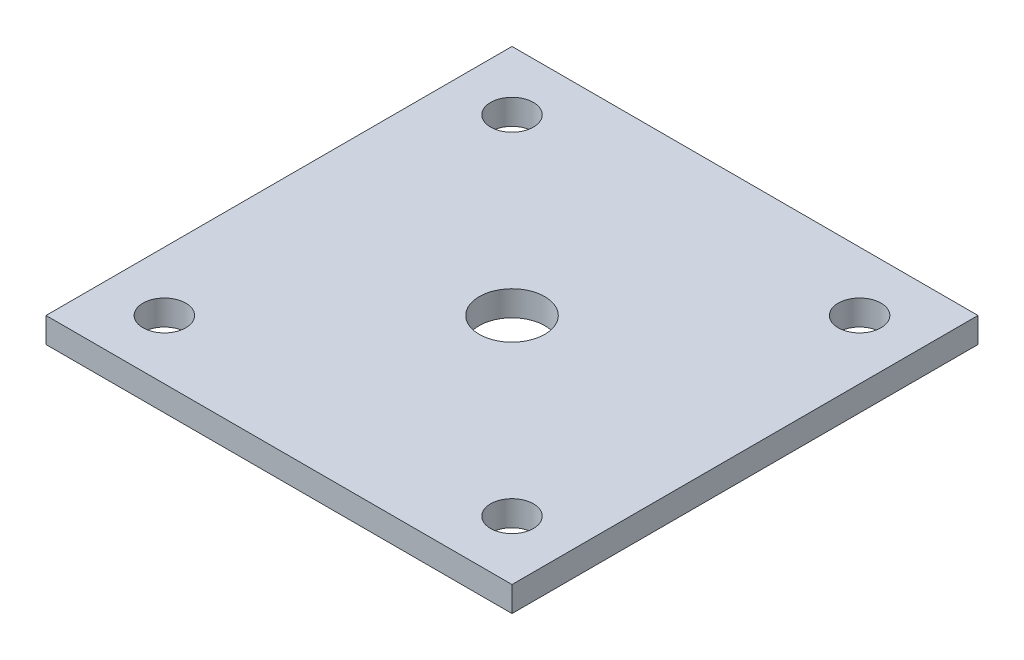
ISO-10303-21;
HEADER;
FILE_DESCRIPTION(('STEP AP214'),'2;1');
FILE_NAME('part.step','',(''),(''),'','','');
FILE_SCHEMA(('AUTOMOTIVE_DESIGN { 1 0 10303 214 1 1 1 1 }'));
ENDSEC;
DATA;
#1=APPLICATION_CONTEXT('core data for automotive mechanical design processes');
#2=APPLICATION_PROTOCOL_DEFINITION('international standard','automotive_design',2000,#1);
#3=PRODUCT_CONTEXT('',#1,'mechanical');
#4=PRODUCT('Part','Part','',(#3));
#5=PRODUCT_RELATED_PRODUCT_CATEGORY('part','',(#4));
#6=PRODUCT_DEFINITION_FORMATION('','',#4);
#7=PRODUCT_DEFINITION_CONTEXT('part definition',#1,'design');
#8=PRODUCT_DEFINITION('design','',#6,#7);
#9=PRODUCT_DEFINITION_SHAPE('','',#8);
#10=(LENGTH_UNIT() NAMED_UNIT(*) SI_UNIT(.MILLI.,.METRE.));
#11=(NAMED_UNIT(*) PLANE_ANGLE_UNIT() SI_UNIT($,.RADIAN.));
#12=(NAMED_UNIT(*) SI_UNIT($,.STERADIAN.) SOLID_ANGLE_UNIT());
#13=UNCERTAINTY_MEASURE_WITH_UNIT(LENGTH_MEASURE(1.E-05),#10,'distance_accuracy_value','');
#14=(GEOMETRIC_REPRESENTATION_CONTEXT(3) GLOBAL_UNCERTAINTY_ASSIGNED_CONTEXT((#13)) GLOBAL_UNIT_ASSIGNED_CONTEXT((#10,
#11,#12)) REPRESENTATION_CONTEXT('',''));
#15=CARTESIAN_POINT('',(0.,0.,0.));
#16=DIRECTION('',(0.,0.,1.));
#17=DIRECTION('',(1.,0.,0.));
#18=AXIS2_PLACEMENT_3D('',#15,#16,#17);
#19=CARTESIAN_POINT('',(0.,2.54,23.495));
#20=DIRECTION('',(0.,0.,-1.));
#21=DIRECTION('',(-1.,0.,0.));
#22=AXIS2_PLACEMENT_3D('',#19,#20,#21);
#23=PLANE('',#22);
#24=DIRECTION('',(1.,0.,0.));
#25=VECTOR('',#24,1.);
#26=CARTESIAN_POINT('',(0.,0.,23.495));
#27=LINE('',#26,#25);
#28=CARTESIAN_POINT('',(-23.495,0.,23.495));
#29=VERTEX_POINT('',#28);
#30=CARTESIAN_POINT('',(23.495,0.,23.495));
#31=VERTEX_POINT('',#30);
#32=EDGE_CURVE('E115',#29,#31,#27,.T.);
#33=ORIENTED_EDGE('',*,*,#32,.T.);
#34=DIRECTION('',(0.,-1.,0.));
#35=VECTOR('',#34,1.);
#36=CARTESIAN_POINT('',(23.495,2.54,23.495));
#37=LINE('',#36,#35);
#38=CARTESIAN_POINT('',(23.495,2.54,23.495));
#39=VERTEX_POINT('',#38);
#40=EDGE_CURVE('E11',#39,#31,#37,.T.);
#41=ORIENTED_EDGE('',*,*,#40,.F.);
#42=DIRECTION('',(1.,0.,0.));
#43=VECTOR('',#42,1.);
#44=CARTESIAN_POINT('',(0.,2.54,23.495));
#45=LINE('',#44,#43);
#46=CARTESIAN_POINT('',(-23.495,2.54,23.495));
#47=VERTEX_POINT('',#46);
#48=EDGE_CURVE('E86',#47,#39,#45,.T.);
#49=ORIENTED_EDGE('',*,*,#48,.F.);
#50=DIRECTION('',(0.,-1.,0.));
#51=VECTOR('',#50,1.);
#52=CARTESIAN_POINT('',(-23.495,2.54,23.495));
#53=LINE('',#52,#51);
#54=EDGE_CURVE('E52',#47,#29,#53,.T.);
#55=ORIENTED_EDGE('',*,*,#54,.T.);
#56=EDGE_LOOP('',(#33,#41,#49,#55));
#57=FACE_BOUND('',#56,.T.);
#58=ADVANCED_FACE('F35',(#57),#23,.F.);
#59=CARTESIAN_POINT('',(23.495,2.54,0.));
#60=DIRECTION('',(-1.,0.,0.));
#61=DIRECTION('',(0.,0.,1.));
#62=AXIS2_PLACEMENT_3D('',#59,#60,#61);
#63=PLANE('',#62);
#64=DIRECTION('',(0.,0.,-1.));
#65=VECTOR('',#64,1.);
#66=CARTESIAN_POINT('',(23.495,0.,0.));
#67=LINE('',#66,#65);
#68=CARTESIAN_POINT('',(23.495,0.,-23.495));
#69=VERTEX_POINT('',#68);
#70=EDGE_CURVE('E91',#31,#69,#67,.T.);
#71=ORIENTED_EDGE('',*,*,#70,.T.);
#72=DIRECTION('',(0.,-1.,0.));
#73=VECTOR('',#72,1.);
#74=CARTESIAN_POINT('',(23.495,2.54,-23.495));
#75=LINE('',#74,#73);
#76=CARTESIAN_POINT('',(23.495,2.54,-23.495));
#77=VERTEX_POINT('',#76);
#78=EDGE_CURVE('E44',#77,#69,#75,.T.);
#79=ORIENTED_EDGE('',*,*,#78,.F.);
#80=DIRECTION('',(0.,0.,-1.));
#81=VECTOR('',#80,1.);
#82=CARTESIAN_POINT('',(23.495,2.54,0.));
#83=LINE('',#82,#81);
#84=EDGE_CURVE('E77',#39,#77,#83,.T.);
#85=ORIENTED_EDGE('',*,*,#84,.F.);
#86=ORIENTED_EDGE('',*,*,#40,.T.);
#87=EDGE_LOOP('',(#71,#79,#85,#86));
#88=FACE_BOUND('',#87,.T.);
#89=ADVANCED_FACE('F90',(#88),#63,.F.);
#90=CARTESIAN_POINT('',(0.,2.54,-23.495));
#91=DIRECTION('',(0.,0.,-1.));
#92=DIRECTION('',(-1.,0.,0.));
#93=AXIS2_PLACEMENT_3D('',#90,#91,#92);
#94=PLANE('',#93);
#95=DIRECTION('',(1.,0.,0.));
#96=VECTOR('',#95,1.);
#97=CARTESIAN_POINT('',(0.,0.,-23.495));
#98=LINE('',#97,#96);
#99=CARTESIAN_POINT('',(-23.495,0.,-23.495));
#100=VERTEX_POINT('',#99);
#101=EDGE_CURVE('E118',#100,#69,#98,.T.);
#102=ORIENTED_EDGE('',*,*,#101,.F.);
#103=DIRECTION('',(0.,-1.,0.));
#104=VECTOR('',#103,1.);
#105=CARTESIAN_POINT('',(-23.495,2.54,-23.495));
#106=LINE('',#105,#104);
#107=CARTESIAN_POINT('',(-23.495,2.54,-23.495));
#108=VERTEX_POINT('',#107);
#109=EDGE_CURVE('E66',#108,#100,#106,.T.);
#110=ORIENTED_EDGE('',*,*,#109,.F.);
#111=DIRECTION('',(1.,0.,0.));
#112=VECTOR('',#111,1.);
#113=CARTESIAN_POINT('',(0.,2.54,-23.495));
#114=LINE('',#113,#112);
#115=EDGE_CURVE('E85',#108,#77,#114,.T.);
#116=ORIENTED_EDGE('',*,*,#115,.T.);
#117=ORIENTED_EDGE('',*,*,#78,.T.);
#118=EDGE_LOOP('',(#102,#110,#116,#117));
#119=FACE_BOUND('',#118,.T.);
#120=ADVANCED_FACE('F94',(#119),#94,.T.);
#121=CARTESIAN_POINT('',(-23.495,2.54,0.));
#122=DIRECTION('',(-1.,0.,0.));
#123=DIRECTION('',(0.,0.,1.));
#124=AXIS2_PLACEMENT_3D('',#121,#122,#123);
#125=PLANE('',#124);
#126=DIRECTION('',(0.,0.,-1.));
#127=VECTOR('',#126,1.);
#128=CARTESIAN_POINT('',(-23.495,0.,0.));
#129=LINE('',#128,#127);
#130=EDGE_CURVE('E120',#29,#100,#129,.T.);
#131=ORIENTED_EDGE('',*,*,#130,.F.);
#132=ORIENTED_EDGE('',*,*,#54,.F.);
#133=DIRECTION('',(0.,0.,-1.));
#134=VECTOR('',#133,1.);
#135=CARTESIAN_POINT('',(-23.495,2.54,0.));
#136=LINE('',#135,#134);
#137=EDGE_CURVE('E95',#47,#108,#136,.T.);
#138=ORIENTED_EDGE('',*,*,#137,.T.);
#139=ORIENTED_EDGE('',*,*,#109,.T.);
#140=EDGE_LOOP('',(#131,#132,#138,#139));
#141=FACE_BOUND('',#140,.T.);
#142=ADVANCED_FACE('F173',(#141),#125,.T.);
#143=CARTESIAN_POINT('',(17.526,2.54,17.526));
#144=DIRECTION('',(0.,-1.,0.));
#145=DIRECTION('',(0.,0.,-1.));
#146=AXIS2_PLACEMENT_3D('',#143,#144,#145);
#147=CYLINDRICAL_SURFACE('',#146,2.159);
#148=CARTESIAN_POINT('',(17.526,2.54,17.526));
#149=DIRECTION('',(0.,1.,0.));
#150=DIRECTION('',(0.,0.,1.));
#151=AXIS2_PLACEMENT_3D('',#148,#149,#150);
#152=CIRCLE('',#151,2.159);
#153=CARTESIAN_POINT('',(17.526,2.54,19.685));
#154=VERTEX_POINT('',#153);
#155=EDGE_CURVE('E141',#154,#154,#152,.T.);
#156=ORIENTED_EDGE('',*,*,#155,.T.);
#157=EDGE_LOOP('',(#156));
#158=FACE_BOUND('',#157,.T.);
#159=CARTESIAN_POINT('',(17.526,0.,17.526));
#160=DIRECTION('',(0.,1.,0.));
#161=DIRECTION('',(0.,0.,1.));
#162=AXIS2_PLACEMENT_3D('',#159,#160,#161);
#163=CIRCLE('',#162,2.159);
#164=CARTESIAN_POINT('',(17.526,0.,19.685));
#165=VERTEX_POINT('',#164);
#166=EDGE_CURVE('E112',#165,#165,#163,.T.);
#167=ORIENTED_EDGE('',*,*,#166,.F.);
#168=EDGE_LOOP('',(#167));
#169=FACE_BOUND('',#168,.T.);
#170=ADVANCED_FACE('F145',(#158,#169),#147,.F.);
#171=CARTESIAN_POINT('',(17.526,2.54,-17.526));
#172=DIRECTION('',(0.,-1.,0.));
#173=DIRECTION('',(0.,0.,-1.));
#174=AXIS2_PLACEMENT_3D('',#171,#172,#173);
#175=CYLINDRICAL_SURFACE('',#174,2.159);
#176=CARTESIAN_POINT('',(17.526,2.54,-17.526));
#177=DIRECTION('',(0.,1.,0.));
#178=DIRECTION('',(0.,0.,1.));
#179=AXIS2_PLACEMENT_3D('',#176,#177,#178);
#180=CIRCLE('',#179,2.159);
#181=CARTESIAN_POINT('',(17.526,2.54,-15.367));
#182=VERTEX_POINT('',#181);
#183=EDGE_CURVE('E136',#182,#182,#180,.T.);
#184=ORIENTED_EDGE('',*,*,#183,.T.);
#185=EDGE_LOOP('',(#184));
#186=FACE_BOUND('',#185,.T.);
#187=CARTESIAN_POINT('',(17.526,0.,-17.526));
#188=DIRECTION('',(0.,1.,0.));
#189=DIRECTION('',(0.,0.,1.));
#190=AXIS2_PLACEMENT_3D('',#187,#188,#189);
#191=CIRCLE('',#190,2.159);
#192=CARTESIAN_POINT('',(17.526,0.,-15.367));
#193=VERTEX_POINT('',#192);
#194=EDGE_CURVE('E109',#193,#193,#191,.T.);
#195=ORIENTED_EDGE('',*,*,#194,.F.);
#196=EDGE_LOOP('',(#195));
#197=FACE_BOUND('',#196,.T.);
#198=ADVANCED_FACE('F172',(#186,#197),#175,.F.);
#199=CARTESIAN_POINT('',(-17.526,2.54,-17.526));
#200=DIRECTION('',(0.,-1.,0.));
#201=DIRECTION('',(0.,0.,-1.));
#202=AXIS2_PLACEMENT_3D('',#199,#200,#201);
#203=CYLINDRICAL_SURFACE('',#202,2.159);
#204=CARTESIAN_POINT('',(-17.526,2.54,-17.526));
#205=DIRECTION('',(0.,1.,0.));
#206=DIRECTION('',(0.,0.,1.));
#207=AXIS2_PLACEMENT_3D('',#204,#205,#206);
#208=CIRCLE('',#207,2.159);
#209=CARTESIAN_POINT('',(-17.526,2.54,-15.367));
#210=VERTEX_POINT('',#209);
#211=EDGE_CURVE('E131',#210,#210,#208,.T.);
#212=ORIENTED_EDGE('',*,*,#211,.T.);
#213=EDGE_LOOP('',(#212));
#214=FACE_BOUND('',#213,.T.);
#215=CARTESIAN_POINT('',(-17.526,0.,-17.526));
#216=DIRECTION('',(0.,1.,0.));
#217=DIRECTION('',(0.,0.,1.));
#218=AXIS2_PLACEMENT_3D('',#215,#216,#217);
#219=CIRCLE('',#218,2.159);
#220=CARTESIAN_POINT('',(-17.526,0.,-15.367));
#221=VERTEX_POINT('',#220);
#222=EDGE_CURVE('E106',#221,#221,#219,.T.);
#223=ORIENTED_EDGE('',*,*,#222,.F.);
#224=EDGE_LOOP('',(#223));
#225=FACE_BOUND('',#224,.T.);
#226=ADVANCED_FACE('F175',(#214,#225),#203,.F.);
#227=CARTESIAN_POINT('',(-17.526,2.54,17.526));
#228=DIRECTION('',(0.,-1.,0.));
#229=DIRECTION('',(0.,0.,-1.));
#230=AXIS2_PLACEMENT_3D('',#227,#228,#229);
#231=CYLINDRICAL_SURFACE('',#230,2.159);
#232=CARTESIAN_POINT('',(-17.526,2.54,17.526));
#233=DIRECTION('',(0.,1.,0.));
#234=DIRECTION('',(0.,0.,1.));
#235=AXIS2_PLACEMENT_3D('',#232,#233,#234);
#236=CIRCLE('',#235,2.159);
#237=CARTESIAN_POINT('',(-17.526,2.54,19.685));
#238=VERTEX_POINT('',#237);
#239=EDGE_CURVE('E126',#238,#238,#236,.T.);
#240=ORIENTED_EDGE('',*,*,#239,.T.);
#241=EDGE_LOOP('',(#240));
#242=FACE_BOUND('',#241,.T.);
#243=CARTESIAN_POINT('',(-17.526,0.,17.526));
#244=DIRECTION('',(0.,1.,0.));
#245=DIRECTION('',(0.,0.,1.));
#246=AXIS2_PLACEMENT_3D('',#243,#244,#245);
#247=CIRCLE('',#246,2.159);
#248=CARTESIAN_POINT('',(-17.526,0.,19.685));
#249=VERTEX_POINT('',#248);
#250=EDGE_CURVE('E103',#249,#249,#247,.T.);
#251=ORIENTED_EDGE('',*,*,#250,.F.);
#252=EDGE_LOOP('',(#251));
#253=FACE_BOUND('',#252,.T.);
#254=ADVANCED_FACE('F37',(#242,#253),#231,.F.);
#255=CARTESIAN_POINT('',(0.,2.54,0.));
#256=DIRECTION('',(0.,-1.,0.));
#257=DIRECTION('',(0.,0.,-1.));
#258=AXIS2_PLACEMENT_3D('',#255,#256,#257);
#259=CYLINDRICAL_SURFACE('',#258,3.302);
#260=CARTESIAN_POINT('',(0.,2.54,0.));
#261=DIRECTION('',(0.,1.,0.));
#262=DIRECTION('',(0.,0.,1.));
#263=AXIS2_PLACEMENT_3D('',#260,#261,#262);
#264=CIRCLE('',#263,3.302);
#265=CARTESIAN_POINT('',(0.,2.54,3.30199999999999));
#266=VERTEX_POINT('',#265);
#267=EDGE_CURVE('E97',#266,#266,#264,.T.);
#268=ORIENTED_EDGE('',*,*,#267,.T.);
#269=EDGE_LOOP('',(#268));
#270=FACE_BOUND('',#269,.T.);
#271=CARTESIAN_POINT('',(0.,0.,0.));
#272=DIRECTION('',(0.,1.,0.));
#273=DIRECTION('',(0.,0.,1.));
#274=AXIS2_PLACEMENT_3D('',#271,#272,#273);
#275=CIRCLE('',#274,3.302);
#276=CARTESIAN_POINT('',(0.,0.,3.30199999999999));
#277=VERTEX_POINT('',#276);
#278=EDGE_CURVE('E123',#277,#277,#275,.T.);
#279=ORIENTED_EDGE('',*,*,#278,.F.);
#280=EDGE_LOOP('',(#279));
#281=FACE_BOUND('',#280,.T.);
#282=ADVANCED_FACE('F150',(#270,#281),#259,.F.);
#283=CARTESIAN_POINT('',(0.,2.54,0.));
#284=DIRECTION('',(0.,1.,0.));
#285=DIRECTION('',(0.,0.,1.));
#286=AXIS2_PLACEMENT_3D('',#283,#284,#285);
#287=PLANE('',#286);
#288=ORIENTED_EDGE('',*,*,#239,.F.);
#289=EDGE_LOOP('',(#288));
#290=FACE_BOUND('',#289,.T.);
#291=ORIENTED_EDGE('',*,*,#211,.F.);
#292=EDGE_LOOP('',(#291));
#293=FACE_BOUND('',#292,.T.);
#294=ORIENTED_EDGE('',*,*,#183,.F.);
#295=EDGE_LOOP('',(#294));
#296=FACE_BOUND('',#295,.T.);
#297=ORIENTED_EDGE('',*,*,#155,.F.);
#298=EDGE_LOOP('',(#297));
#299=FACE_BOUND('',#298,.T.);
#300=ORIENTED_EDGE('',*,*,#48,.T.);
#301=ORIENTED_EDGE('',*,*,#84,.T.);
#302=ORIENTED_EDGE('',*,*,#115,.F.);
#303=ORIENTED_EDGE('',*,*,#137,.F.);
#304=EDGE_LOOP('',(#300,#301,#302,#303));
#305=FACE_BOUND('',#304,.T.);
#306=ORIENTED_EDGE('',*,*,#267,.F.);
#307=EDGE_LOOP('',(#306));
#308=FACE_BOUND('',#307,.T.);
#309=ADVANCED_FACE('F81',(#290,#293,#296,#299,#305,#308),#287,.T.);
#310=CARTESIAN_POINT('',(0.,0.,0.));
#311=DIRECTION('',(0.,1.,0.));
#312=DIRECTION('',(0.,0.,1.));
#313=AXIS2_PLACEMENT_3D('',#310,#311,#312);
#314=PLANE('',#313);
#315=ORIENTED_EDGE('',*,*,#250,.T.);
#316=EDGE_LOOP('',(#315));
#317=FACE_BOUND('',#316,.T.);
#318=ORIENTED_EDGE('',*,*,#222,.T.);
#319=EDGE_LOOP('',(#318));
#320=FACE_BOUND('',#319,.T.);
#321=ORIENTED_EDGE('',*,*,#194,.T.);
#322=EDGE_LOOP('',(#321));
#323=FACE_BOUND('',#322,.T.);
#324=ORIENTED_EDGE('',*,*,#166,.T.);
#325=EDGE_LOOP('',(#324));
#326=FACE_BOUND('',#325,.T.);
#327=ORIENTED_EDGE('',*,*,#32,.F.);
#328=ORIENTED_EDGE('',*,*,#130,.T.);
#329=ORIENTED_EDGE('',*,*,#101,.T.);
#330=ORIENTED_EDGE('',*,*,#70,.F.);
#331=EDGE_LOOP('',(#327,#328,#329,#330));
#332=FACE_BOUND('',#331,.T.);
#333=ORIENTED_EDGE('',*,*,#278,.T.);
#334=EDGE_LOOP('',(#333));
#335=FACE_BOUND('',#334,.T.);
#336=ADVANCED_FACE('F149',(#317,#320,#323,#326,#332,#335),#314,.F.);
#337=CLOSED_SHELL('',(#58,#89,#120,#142,#170,#198,#226,#254,#282,#309,#336));
#338=MANIFOLD_SOLID_BREP('B2',#337);
#339=ADVANCED_BREP_SHAPE_REPRESENTATION('',(#18,#338),#14);
#340=SHAPE_DEFINITION_REPRESENTATION(#9,#339);
ENDSEC;
END-ISO-10303-21;
